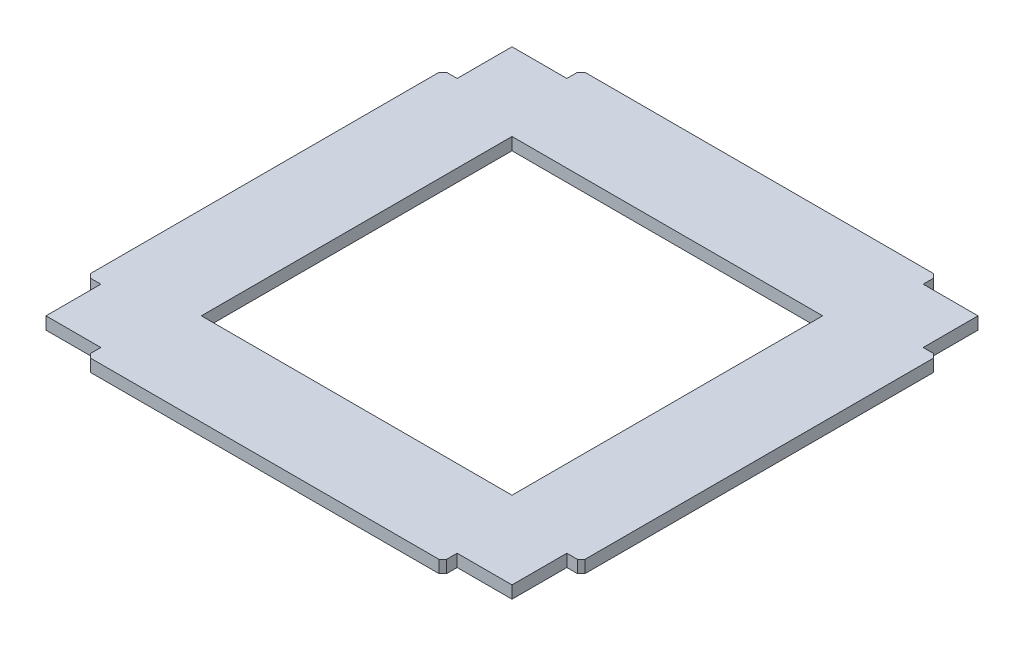
ISO-10303-21;
HEADER;
FILE_DESCRIPTION(('STEP AP214'),'2;1');
FILE_NAME('part.step','',(''),(''),'','','');
FILE_SCHEMA(('AUTOMOTIVE_DESIGN { 1 0 10303 214 1 1 1 1 }'));
ENDSEC;
DATA;
#1=APPLICATION_CONTEXT('core data for automotive mechanical design processes');
#2=APPLICATION_PROTOCOL_DEFINITION('international standard','automotive_design',2000,#1);
#3=PRODUCT_CONTEXT('',#1,'mechanical');
#4=PRODUCT('Part','Part','',(#3));
#5=PRODUCT_RELATED_PRODUCT_CATEGORY('part','',(#4));
#6=PRODUCT_DEFINITION_FORMATION('','',#4);
#7=PRODUCT_DEFINITION_CONTEXT('part definition',#1,'design');
#8=PRODUCT_DEFINITION('design','',#6,#7);
#9=PRODUCT_DEFINITION_SHAPE('','',#8);
#10=(LENGTH_UNIT() NAMED_UNIT(*) SI_UNIT(.MILLI.,.METRE.));
#11=(NAMED_UNIT(*) PLANE_ANGLE_UNIT() SI_UNIT($,.RADIAN.));
#12=(NAMED_UNIT(*) SI_UNIT($,.STERADIAN.) SOLID_ANGLE_UNIT());
#13=UNCERTAINTY_MEASURE_WITH_UNIT(LENGTH_MEASURE(1.E-05),#10,'distance_accuracy_value','');
#14=(GEOMETRIC_REPRESENTATION_CONTEXT(3) GLOBAL_UNCERTAINTY_ASSIGNED_CONTEXT((#13)) GLOBAL_UNIT_ASSIGNED_CONTEXT((#10,
#11,#12)) REPRESENTATION_CONTEXT('',''));
#15=CARTESIAN_POINT('',(0.,0.,0.));
#16=DIRECTION('',(0.,0.,1.));
#17=DIRECTION('',(1.,0.,0.));
#18=AXIS2_PLACEMENT_3D('',#15,#16,#17);
#19=CARTESIAN_POINT('',(963.13625,232.880925964842,80.899));
#20=DIRECTION('',(-1.,0.,0.));
#21=DIRECTION('',(0.,0.,1.));
#22=AXIS2_PLACEMENT_3D('',#19,#20,#21);
#23=PLANE('',#22);
#24=DIRECTION('',(0.,0.,-1.));
#25=VECTOR('',#24,1.);
#26=CARTESIAN_POINT('',(963.13625,4.06400000000001,80.899));
#27=LINE('',#26,#25);
#28=CARTESIAN_POINT('',(963.13625,4.06400000000001,79.6490000000001));
#29=VERTEX_POINT('',#28);
#30=CARTESIAN_POINT('',(963.13625,4.06400000000001,76.2000000000001));
#31=VERTEX_POINT('',#30);
#32=EDGE_CURVE('E512',#29,#31,#27,.T.);
#33=ORIENTED_EDGE('',*,*,#32,.F.);
#34=DIRECTION('',(0.,-1.,0.));
#35=VECTOR('',#34,1.);
#36=CARTESIAN_POINT('',(963.13625,232.880925964842,79.6490000000001));
#37=LINE('',#36,#35);
#38=CARTESIAN_POINT('',(963.13625,0.,79.6490000000001));
#39=VERTEX_POINT('',#38);
#40=EDGE_CURVE('E399',#29,#39,#37,.T.);
#41=ORIENTED_EDGE('',*,*,#40,.T.);
#42=DIRECTION('',(0.,0.,-1.));
#43=VECTOR('',#42,1.);
#44=CARTESIAN_POINT('',(963.13625,0.,80.899));
#45=LINE('',#44,#43);
#46=CARTESIAN_POINT('',(963.13625,0.,76.2000000000001));
#47=VERTEX_POINT('',#46);
#48=EDGE_CURVE('E330',#39,#47,#45,.T.);
#49=ORIENTED_EDGE('',*,*,#48,.T.);
#50=DIRECTION('',(0.,-1.,0.));
#51=VECTOR('',#50,1.);
#52=CARTESIAN_POINT('',(963.13625,232.880925964842,76.2000000000001));
#53=LINE('',#52,#51);
#54=EDGE_CURVE('E332',#31,#47,#53,.T.);
#55=ORIENTED_EDGE('',*,*,#54,.F.);
#56=EDGE_LOOP('',(#33,#41,#49,#55));
#57=FACE_BOUND('',#56,.T.);
#58=ADVANCED_FACE('F33',(#57),#23,.F.);
#59=CARTESIAN_POINT('',(846.613750000001,232.880925964842,80.899));
#60=DIRECTION('',(0.,0.,-1.));
#61=DIRECTION('',(-1.,0.,0.));
#62=AXIS2_PLACEMENT_3D('',#59,#60,#61);
#63=PLANE('',#62);
#64=DIRECTION('',(1.,0.,0.));
#65=VECTOR('',#64,1.);
#66=CARTESIAN_POINT('',(846.613750000001,0.,80.899));
#67=LINE('',#66,#65);
#68=CARTESIAN_POINT('',(847.863750000001,0.,80.899));
#69=VERTEX_POINT('',#68);
#70=CARTESIAN_POINT('',(961.88625,0.,80.899));
#71=VERTEX_POINT('',#70);
#72=EDGE_CURVE('E328',#69,#71,#67,.T.);
#73=ORIENTED_EDGE('',*,*,#72,.T.);
#74=DIRECTION('',(0.,1.,0.));
#75=VECTOR('',#74,1.);
#76=CARTESIAN_POINT('',(961.88625,232.880925964842,80.899));
#77=LINE('',#76,#75);
#78=CARTESIAN_POINT('',(961.88625,4.06400000000001,80.899));
#79=VERTEX_POINT('',#78);
#80=EDGE_CURVE('E48',#71,#79,#77,.T.);
#81=ORIENTED_EDGE('',*,*,#80,.T.);
#82=DIRECTION('',(1.,0.,0.));
#83=VECTOR('',#82,1.);
#84=CARTESIAN_POINT('',(846.613750000001,4.06400000000001,80.899));
#85=LINE('',#84,#83);
#86=CARTESIAN_POINT('',(847.863750000001,4.06400000000001,80.899));
#87=VERTEX_POINT('',#86);
#88=EDGE_CURVE('E516',#87,#79,#85,.T.);
#89=ORIENTED_EDGE('',*,*,#88,.F.);
#90=DIRECTION('',(0.,-1.,0.));
#91=VECTOR('',#90,1.);
#92=CARTESIAN_POINT('',(847.863750000001,232.880925964842,80.899));
#93=LINE('',#92,#91);
#94=EDGE_CURVE('E402',#87,#69,#93,.T.);
#95=ORIENTED_EDGE('',*,*,#94,.T.);
#96=EDGE_LOOP('',(#73,#81,#89,#95));
#97=FACE_BOUND('',#96,.T.);
#98=ADVANCED_FACE('F535',(#97),#63,.F.);
#99=CARTESIAN_POINT('',(846.613750000001,232.880925964842,80.899));
#100=DIRECTION('',(1.,0.,0.));
#101=DIRECTION('',(0.,0.,-1.));
#102=AXIS2_PLACEMENT_3D('',#99,#100,#101);
#103=PLANE('',#102);
#104=DIRECTION('',(0.,0.,1.));
#105=VECTOR('',#104,1.);
#106=CARTESIAN_POINT('',(846.613750000001,0.,80.899));
#107=LINE('',#106,#105);
#108=CARTESIAN_POINT('',(846.613750000001,0.,76.2000000000001));
#109=VERTEX_POINT('',#108);
#110=CARTESIAN_POINT('',(846.613750000001,0.,79.649));
#111=VERTEX_POINT('',#110);
#112=EDGE_CURVE('E325',#109,#111,#107,.T.);
#113=ORIENTED_EDGE('',*,*,#112,.T.);
#114=DIRECTION('',(0.,1.,0.));
#115=VECTOR('',#114,1.);
#116=CARTESIAN_POINT('',(846.613750000001,232.880925964842,79.649));
#117=LINE('',#116,#115);
#118=CARTESIAN_POINT('',(846.613750000001,4.06400000000001,79.649));
#119=VERTEX_POINT('',#118);
#120=EDGE_CURVE('E406',#111,#119,#117,.T.);
#121=ORIENTED_EDGE('',*,*,#120,.T.);
#122=DIRECTION('',(0.,0.,1.));
#123=VECTOR('',#122,1.);
#124=CARTESIAN_POINT('',(846.613750000001,4.06400000000001,80.899));
#125=LINE('',#124,#123);
#126=CARTESIAN_POINT('',(846.613750000001,4.06400000000007,76.2000000000001));
#127=VERTEX_POINT('',#126);
#128=EDGE_CURVE('E518',#127,#119,#125,.T.);
#129=ORIENTED_EDGE('',*,*,#128,.F.);
#130=DIRECTION('',(0.,-1.,0.));
#131=VECTOR('',#130,1.);
#132=CARTESIAN_POINT('',(846.613750000001,232.880925964842,76.2000000000001));
#133=LINE('',#132,#131);
#134=EDGE_CURVE('E335',#127,#109,#133,.T.);
#135=ORIENTED_EDGE('',*,*,#134,.T.);
#136=EDGE_LOOP('',(#113,#121,#129,#135));
#137=FACE_BOUND('',#136,.T.);
#138=ADVANCED_FACE('F531',(#137),#103,.F.);
#139=CARTESIAN_POINT('',(846.613750000001,232.880925964842,76.2000000000001));
#140=DIRECTION('',(0.,0.,-1.));
#141=DIRECTION('',(-1.,0.,0.));
#142=AXIS2_PLACEMENT_3D('',#139,#140,#141);
#143=PLANE('',#142);
#144=DIRECTION('',(1.,0.,0.));
#145=VECTOR('',#144,1.);
#146=CARTESIAN_POINT('',(846.613750000001,4.06400000000001,76.2000000000001));
#147=LINE('',#146,#145);
#148=CARTESIAN_POINT('',(828.675,4.06400000000007,76.2000000000001));
#149=VERTEX_POINT('',#148);
#150=EDGE_CURVE('E465',#149,#127,#147,.T.);
#151=ORIENTED_EDGE('',*,*,#150,.F.);
#152=DIRECTION('',(0.,-1.,0.));
#153=VECTOR('',#152,1.);
#154=CARTESIAN_POINT('',(828.675,232.880925964842,76.2000000000001));
#155=LINE('',#154,#153);
#156=CARTESIAN_POINT('',(828.675,0.,76.2000000000001));
#157=VERTEX_POINT('',#156);
#158=EDGE_CURVE('E337',#149,#157,#155,.T.);
#159=ORIENTED_EDGE('',*,*,#158,.T.);
#160=DIRECTION('',(1.,0.,0.));
#161=VECTOR('',#160,1.);
#162=CARTESIAN_POINT('',(846.613750000001,0.,76.2000000000001));
#163=LINE('',#162,#161);
#164=EDGE_CURVE('E322',#157,#109,#163,.T.);
#165=ORIENTED_EDGE('',*,*,#164,.T.);
#166=ORIENTED_EDGE('',*,*,#134,.F.);
#167=EDGE_LOOP('',(#151,#159,#165,#166));
#168=FACE_BOUND('',#167,.T.);
#169=ADVANCED_FACE('F523',(#168),#143,.F.);
#170=CARTESIAN_POINT('',(828.675,232.880925964842,76.2000000000001));
#171=DIRECTION('',(1.,0.,0.));
#172=DIRECTION('',(0.,0.,-1.));
#173=AXIS2_PLACEMENT_3D('',#170,#171,#172);
#174=PLANE('',#173);
#175=DIRECTION('',(0.,0.,1.));
#176=VECTOR('',#175,1.);
#177=CARTESIAN_POINT('',(828.675,4.06400000000001,76.2000000000001));
#178=LINE('',#177,#176);
#179=CARTESIAN_POINT('',(828.675,4.06400000000007,58.2612499999995));
#180=VERTEX_POINT('',#179);
#181=EDGE_CURVE('E462',#180,#149,#178,.T.);
#182=ORIENTED_EDGE('',*,*,#181,.F.);
#183=DIRECTION('',(0.,-1.,0.));
#184=VECTOR('',#183,1.);
#185=CARTESIAN_POINT('',(828.675,232.880925964842,58.2612499999995));
#186=LINE('',#185,#184);
#187=CARTESIAN_POINT('',(828.675,0.,58.2612499999995));
#188=VERTEX_POINT('',#187);
#189=EDGE_CURVE('E339',#180,#188,#186,.T.);
#190=ORIENTED_EDGE('',*,*,#189,.T.);
#191=DIRECTION('',(0.,0.,1.));
#192=VECTOR('',#191,1.);
#193=CARTESIAN_POINT('',(828.675,0.,76.2000000000001));
#194=LINE('',#193,#192);
#195=EDGE_CURVE('E319',#188,#157,#194,.T.);
#196=ORIENTED_EDGE('',*,*,#195,.T.);
#197=ORIENTED_EDGE('',*,*,#158,.F.);
#198=EDGE_LOOP('',(#182,#190,#196,#197));
#199=FACE_BOUND('',#198,.T.);
#200=ADVANCED_FACE('F525',(#199),#174,.F.);
#201=CARTESIAN_POINT('',(823.976,232.880925964842,58.2612499999995));
#202=DIRECTION('',(0.,0.,-1.));
#203=DIRECTION('',(-1.,0.,0.));
#204=AXIS2_PLACEMENT_3D('',#201,#202,#203);
#205=PLANE('',#204);
#206=DIRECTION('',(1.,0.,0.));
#207=VECTOR('',#206,1.);
#208=CARTESIAN_POINT('',(823.976,4.06400000000001,58.2612499999995));
#209=LINE('',#208,#207);
#210=CARTESIAN_POINT('',(825.226,4.06400000000001,58.2612499999995));
#211=VERTEX_POINT('',#210);
#212=EDGE_CURVE('E459',#211,#180,#209,.T.);
#213=ORIENTED_EDGE('',*,*,#212,.F.);
#214=DIRECTION('',(0.,-1.,0.));
#215=VECTOR('',#214,1.);
#216=CARTESIAN_POINT('',(825.226,232.880925964842,58.2612499999995));
#217=LINE('',#216,#215);
#218=CARTESIAN_POINT('',(825.226,0.,58.2612499999995));
#219=VERTEX_POINT('',#218);
#220=EDGE_CURVE('E408',#211,#219,#217,.T.);
#221=ORIENTED_EDGE('',*,*,#220,.T.);
#222=DIRECTION('',(1.,0.,0.));
#223=VECTOR('',#222,1.);
#224=CARTESIAN_POINT('',(823.976,0.,58.2612499999995));
#225=LINE('',#224,#223);
#226=EDGE_CURVE('E317',#219,#188,#225,.T.);
#227=ORIENTED_EDGE('',*,*,#226,.T.);
#228=ORIENTED_EDGE('',*,*,#189,.F.);
#229=EDGE_LOOP('',(#213,#221,#227,#228));
#230=FACE_BOUND('',#229,.T.);
#231=ADVANCED_FACE('F457',(#230),#205,.F.);
#232=CARTESIAN_POINT('',(823.976,232.880925964842,-58.2612499999998));
#233=DIRECTION('',(1.,0.,0.));
#234=DIRECTION('',(0.,0.,-1.));
#235=AXIS2_PLACEMENT_3D('',#232,#233,#234);
#236=PLANE('',#235);
#237=DIRECTION('',(0.,0.,1.));
#238=VECTOR('',#237,1.);
#239=CARTESIAN_POINT('',(823.976,0.,-58.2612499999998));
#240=LINE('',#239,#238);
#241=CARTESIAN_POINT('',(823.976,0.,-57.0112499999999));
#242=VERTEX_POINT('',#241);
#243=CARTESIAN_POINT('',(823.976,0.,57.0112499999995));
#244=VERTEX_POINT('',#243);
#245=EDGE_CURVE('E314',#242,#244,#240,.T.);
#246=ORIENTED_EDGE('',*,*,#245,.T.);
#247=DIRECTION('',(0.,1.,0.));
#248=VECTOR('',#247,1.);
#249=CARTESIAN_POINT('',(823.976,232.880925964842,57.0112499999995));
#250=LINE('',#249,#248);
#251=CARTESIAN_POINT('',(823.976,4.06400000000001,57.0112499999995));
#252=VERTEX_POINT('',#251);
#253=EDGE_CURVE('E414',#244,#252,#250,.T.);
#254=ORIENTED_EDGE('',*,*,#253,.T.);
#255=DIRECTION('',(0.,0.,1.));
#256=VECTOR('',#255,1.);
#257=CARTESIAN_POINT('',(823.976,4.06400000000001,-58.2612499999998));
#258=LINE('',#257,#256);
#259=CARTESIAN_POINT('',(823.976,4.06400000000001,-57.0112499999999));
#260=VERTEX_POINT('',#259);
#261=EDGE_CURVE('E437',#260,#252,#258,.T.);
#262=ORIENTED_EDGE('',*,*,#261,.F.);
#263=DIRECTION('',(0.,-1.,0.));
#264=VECTOR('',#263,1.);
#265=CARTESIAN_POINT('',(823.976,232.880925964842,-57.0112499999999));
#266=LINE('',#265,#264);
#267=EDGE_CURVE('E411',#260,#242,#266,.T.);
#268=ORIENTED_EDGE('',*,*,#267,.T.);
#269=EDGE_LOOP('',(#246,#254,#262,#268));
#270=FACE_BOUND('',#269,.T.);
#271=ADVANCED_FACE('F443',(#270),#236,.F.);
#272=CARTESIAN_POINT('',(823.976,232.880925964842,-58.2612499999998));
#273=DIRECTION('',(0.,0.,1.));
#274=DIRECTION('',(1.,0.,0.));
#275=AXIS2_PLACEMENT_3D('',#272,#273,#274);
#276=PLANE('',#275);
#277=DIRECTION('',(-1.,0.,0.));
#278=VECTOR('',#277,1.);
#279=CARTESIAN_POINT('',(823.976,0.,-58.2612499999998));
#280=LINE('',#279,#278);
#281=CARTESIAN_POINT('',(828.675,0.,-58.2612499999998));
#282=VERTEX_POINT('',#281);
#283=CARTESIAN_POINT('',(825.226,0.,-58.2612499999998));
#284=VERTEX_POINT('',#283);
#285=EDGE_CURVE('E311',#282,#284,#280,.T.);
#286=ORIENTED_EDGE('',*,*,#285,.T.);
#287=DIRECTION('',(0.,1.,0.));
#288=VECTOR('',#287,1.);
#289=CARTESIAN_POINT('',(825.226,232.880925964842,-58.2612499999998));
#290=LINE('',#289,#288);
#291=CARTESIAN_POINT('',(825.226,4.06400000000001,-58.2612499999998));
#292=VERTEX_POINT('',#291);
#293=EDGE_CURVE('E41',#284,#292,#290,.T.);
#294=ORIENTED_EDGE('',*,*,#293,.T.);
#295=DIRECTION('',(-1.,0.,0.));
#296=VECTOR('',#295,1.);
#297=CARTESIAN_POINT('',(823.976,4.06400000000001,-58.2612499999998));
#298=LINE('',#297,#296);
#299=CARTESIAN_POINT('',(828.675,4.06400000000007,-58.2612499999998));
#300=VERTEX_POINT('',#299);
#301=EDGE_CURVE('E426',#300,#292,#298,.T.);
#302=ORIENTED_EDGE('',*,*,#301,.F.);
#303=DIRECTION('',(0.,-1.,0.));
#304=VECTOR('',#303,1.);
#305=CARTESIAN_POINT('',(828.675,232.880925964842,-58.2612499999998));
#306=LINE('',#305,#304);
#307=EDGE_CURVE('E342',#300,#282,#306,.T.);
#308=ORIENTED_EDGE('',*,*,#307,.T.);
#309=EDGE_LOOP('',(#286,#294,#302,#308));
#310=FACE_BOUND('',#309,.T.);
#311=ADVANCED_FACE('F425',(#310),#276,.F.);
#312=CARTESIAN_POINT('',(828.675,232.880925964842,-58.2612499999998));
#313=DIRECTION('',(1.,0.,0.));
#314=DIRECTION('',(0.,0.,-1.));
#315=AXIS2_PLACEMENT_3D('',#312,#313,#314);
#316=PLANE('',#315);
#317=DIRECTION('',(0.,0.,1.));
#318=VECTOR('',#317,1.);
#319=CARTESIAN_POINT('',(828.675,4.06400000000001,-58.2612499999998));
#320=LINE('',#319,#318);
#321=CARTESIAN_POINT('',(828.675,4.06400000000007,-76.2));
#322=VERTEX_POINT('',#321);
#323=EDGE_CURVE('E436',#322,#300,#320,.T.);
#324=ORIENTED_EDGE('',*,*,#323,.F.);
#325=DIRECTION('',(0.,-1.,0.));
#326=VECTOR('',#325,1.);
#327=CARTESIAN_POINT('',(828.675,232.880925964842,-76.2));
#328=LINE('',#327,#326);
#329=CARTESIAN_POINT('',(828.675,0.,-76.2));
#330=VERTEX_POINT('',#329);
#331=EDGE_CURVE('E344',#322,#330,#328,.T.);
#332=ORIENTED_EDGE('',*,*,#331,.T.);
#333=DIRECTION('',(0.,0.,1.));
#334=VECTOR('',#333,1.);
#335=CARTESIAN_POINT('',(828.675,0.,-58.2612499999998));
#336=LINE('',#335,#334);
#337=EDGE_CURVE('E308',#330,#282,#336,.T.);
#338=ORIENTED_EDGE('',*,*,#337,.T.);
#339=ORIENTED_EDGE('',*,*,#307,.F.);
#340=EDGE_LOOP('',(#324,#332,#338,#339));
#341=FACE_BOUND('',#340,.T.);
#342=ADVANCED_FACE('F610',(#341),#316,.F.);
#343=CARTESIAN_POINT('',(828.675,232.880925964842,-76.2));
#344=DIRECTION('',(0.,0.,1.));
#345=DIRECTION('',(1.,0.,0.));
#346=AXIS2_PLACEMENT_3D('',#343,#344,#345);
#347=PLANE('',#346);
#348=DIRECTION('',(-1.,0.,0.));
#349=VECTOR('',#348,1.);
#350=CARTESIAN_POINT('',(828.675,4.06400000000001,-76.2));
#351=LINE('',#350,#349);
#352=CARTESIAN_POINT('',(846.61375,4.06400000000007,-76.2));
#353=VERTEX_POINT('',#352);
#354=EDGE_CURVE('E470',#353,#322,#351,.T.);
#355=ORIENTED_EDGE('',*,*,#354,.F.);
#356=DIRECTION('',(0.,-1.,0.));
#357=VECTOR('',#356,1.);
#358=CARTESIAN_POINT('',(846.61375,232.880925964842,-76.2));
#359=LINE('',#358,#357);
#360=CARTESIAN_POINT('',(846.61375,0.,-76.2));
#361=VERTEX_POINT('',#360);
#362=EDGE_CURVE('E346',#353,#361,#359,.T.);
#363=ORIENTED_EDGE('',*,*,#362,.T.);
#364=DIRECTION('',(-1.,0.,0.));
#365=VECTOR('',#364,1.);
#366=CARTESIAN_POINT('',(828.675,0.,-76.2));
#367=LINE('',#366,#365);
#368=EDGE_CURVE('E305',#361,#330,#367,.T.);
#369=ORIENTED_EDGE('',*,*,#368,.T.);
#370=ORIENTED_EDGE('',*,*,#331,.F.);
#371=EDGE_LOOP('',(#355,#363,#369,#370));
#372=FACE_BOUND('',#371,.T.);
#373=ADVANCED_FACE('F607',(#372),#347,.F.);
#374=CARTESIAN_POINT('',(846.61375,232.880925964842,-80.8990000000002));
#375=DIRECTION('',(1.,0.,0.));
#376=DIRECTION('',(0.,0.,-1.));
#377=AXIS2_PLACEMENT_3D('',#374,#375,#376);
#378=PLANE('',#377);
#379=DIRECTION('',(0.,0.,1.));
#380=VECTOR('',#379,1.);
#381=CARTESIAN_POINT('',(846.61375,4.06400000000001,-80.8990000000002));
#382=LINE('',#381,#380);
#383=CARTESIAN_POINT('',(846.61375,4.06400000000001,-79.6490000000003));
#384=VERTEX_POINT('',#383);
#385=EDGE_CURVE('E472',#384,#353,#382,.T.);
#386=ORIENTED_EDGE('',*,*,#385,.F.);
#387=DIRECTION('',(0.,-1.,0.));
#388=VECTOR('',#387,1.);
#389=CARTESIAN_POINT('',(846.61375,232.880925964842,-79.6490000000003));
#390=LINE('',#389,#388);
#391=CARTESIAN_POINT('',(846.61375,0.,-79.6490000000003));
#392=VERTEX_POINT('',#391);
#393=EDGE_CURVE('E11',#384,#392,#390,.T.);
#394=ORIENTED_EDGE('',*,*,#393,.T.);
#395=DIRECTION('',(0.,0.,1.));
#396=VECTOR('',#395,1.);
#397=CARTESIAN_POINT('',(846.61375,0.,-80.8990000000002));
#398=LINE('',#397,#396);
#399=EDGE_CURVE('E303',#392,#361,#398,.T.);
#400=ORIENTED_EDGE('',*,*,#399,.T.);
#401=ORIENTED_EDGE('',*,*,#362,.F.);
#402=EDGE_LOOP('',(#386,#394,#400,#401));
#403=FACE_BOUND('',#402,.T.);
#404=ADVANCED_FACE('F602',(#403),#378,.F.);
#405=CARTESIAN_POINT('',(846.61375,232.880925964842,-80.8990000000002));
#406=DIRECTION('',(0.,0.,1.));
#407=DIRECTION('',(1.,0.,0.));
#408=AXIS2_PLACEMENT_3D('',#405,#406,#407);
#409=PLANE('',#408);
#410=DIRECTION('',(-1.,0.,0.));
#411=VECTOR('',#410,1.);
#412=CARTESIAN_POINT('',(846.61375,4.06400000000001,-80.8990000000002));
#413=LINE('',#412,#411);
#414=CARTESIAN_POINT('',(961.88625,4.06400000000001,-80.899));
#415=VERTEX_POINT('',#414);
#416=CARTESIAN_POINT('',(847.86375,4.06400000000001,-80.8990000000002));
#417=VERTEX_POINT('',#416);
#418=EDGE_CURVE('E474',#415,#417,#413,.T.);
#419=ORIENTED_EDGE('',*,*,#418,.F.);
#420=DIRECTION('',(0.,-1.,0.));
#421=VECTOR('',#420,1.);
#422=CARTESIAN_POINT('',(961.88625,232.880925964842,-80.899));
#423=LINE('',#422,#421);
#424=CARTESIAN_POINT('',(961.88625,0.,-80.899));
#425=VERTEX_POINT('',#424);
#426=EDGE_CURVE('E418',#415,#425,#423,.T.);
#427=ORIENTED_EDGE('',*,*,#426,.T.);
#428=DIRECTION('',(-1.,0.,0.));
#429=VECTOR('',#428,1.);
#430=CARTESIAN_POINT('',(846.61375,0.,-80.8990000000002));
#431=LINE('',#430,#429);
#432=CARTESIAN_POINT('',(847.86375,0.,-80.8990000000002));
#433=VERTEX_POINT('',#432);
#434=EDGE_CURVE('E300',#425,#433,#431,.T.);
#435=ORIENTED_EDGE('',*,*,#434,.T.);
#436=DIRECTION('',(0.,1.,0.));
#437=VECTOR('',#436,1.);
#438=CARTESIAN_POINT('',(847.86375,232.880925964842,-80.8990000000002));
#439=LINE('',#438,#437);
#440=EDGE_CURVE('E416',#433,#417,#439,.T.);
#441=ORIENTED_EDGE('',*,*,#440,.T.);
#442=EDGE_LOOP('',(#419,#427,#435,#441));
#443=FACE_BOUND('',#442,.T.);
#444=ADVANCED_FACE('F593',(#443),#409,.F.);
#445=CARTESIAN_POINT('',(963.13625,232.880925964842,-80.899));
#446=DIRECTION('',(-1.,0.,0.));
#447=DIRECTION('',(0.,0.,1.));
#448=AXIS2_PLACEMENT_3D('',#445,#446,#447);
#449=PLANE('',#448);
#450=DIRECTION('',(0.,0.,-1.));
#451=VECTOR('',#450,1.);
#452=CARTESIAN_POINT('',(963.13625,0.,-80.899));
#453=LINE('',#452,#451);
#454=CARTESIAN_POINT('',(963.13625,0.,-76.1999999999999));
#455=VERTEX_POINT('',#454);
#456=CARTESIAN_POINT('',(963.13625,0.,-79.6490000000001));
#457=VERTEX_POINT('',#456);
#458=EDGE_CURVE('E297',#455,#457,#453,.T.);
#459=ORIENTED_EDGE('',*,*,#458,.T.);
#460=DIRECTION('',(0.,1.,0.));
#461=VECTOR('',#460,1.);
#462=CARTESIAN_POINT('',(963.13625,232.880925964842,-79.6490000000001));
#463=LINE('',#462,#461);
#464=CARTESIAN_POINT('',(963.13625,4.06400000000001,-79.6490000000001));
#465=VERTEX_POINT('',#464);
#466=EDGE_CURVE('E421',#457,#465,#463,.T.);
#467=ORIENTED_EDGE('',*,*,#466,.T.);
#468=DIRECTION('',(0.,0.,-1.));
#469=VECTOR('',#468,1.);
#470=CARTESIAN_POINT('',(963.13625,4.06400000000001,-80.899));
#471=LINE('',#470,#469);
#472=CARTESIAN_POINT('',(963.13625,4.06400000000007,-76.1999999999999));
#473=VERTEX_POINT('',#472);
#474=EDGE_CURVE('E477',#473,#465,#471,.T.);
#475=ORIENTED_EDGE('',*,*,#474,.F.);
#476=DIRECTION('',(0.,-1.,0.));
#477=VECTOR('',#476,1.);
#478=CARTESIAN_POINT('',(963.13625,232.880925964842,-76.1999999999999));
#479=LINE('',#478,#477);
#480=EDGE_CURVE('E349',#473,#455,#479,.T.);
#481=ORIENTED_EDGE('',*,*,#480,.T.);
#482=EDGE_LOOP('',(#459,#467,#475,#481));
#483=FACE_BOUND('',#482,.T.);
#484=ADVANCED_FACE('F675',(#483),#449,.F.);
#485=CARTESIAN_POINT('',(963.13625,232.880925964842,-76.1999999999999));
#486=DIRECTION('',(0.,0.,1.));
#487=DIRECTION('',(1.,0.,0.));
#488=AXIS2_PLACEMENT_3D('',#485,#486,#487);
#489=PLANE('',#488);
#490=DIRECTION('',(-1.,0.,0.));
#491=VECTOR('',#490,1.);
#492=CARTESIAN_POINT('',(963.13625,4.06400000000001,-76.1999999999999));
#493=LINE('',#492,#491);
#494=CARTESIAN_POINT('',(981.075,4.06400000000007,-76.2));
#495=VERTEX_POINT('',#494);
#496=EDGE_CURVE('E480',#495,#473,#493,.T.);
#497=ORIENTED_EDGE('',*,*,#496,.F.);
#498=DIRECTION('',(0.,-1.,0.));
#499=VECTOR('',#498,1.);
#500=CARTESIAN_POINT('',(981.075,232.880925964842,-76.2));
#501=LINE('',#500,#499);
#502=CARTESIAN_POINT('',(981.075,0.,-76.2));
#503=VERTEX_POINT('',#502);
#504=EDGE_CURVE('E351',#495,#503,#501,.T.);
#505=ORIENTED_EDGE('',*,*,#504,.T.);
#506=DIRECTION('',(-1.,0.,0.));
#507=VECTOR('',#506,1.);
#508=CARTESIAN_POINT('',(963.13625,0.,-76.1999999999999));
#509=LINE('',#508,#507);
#510=EDGE_CURVE('E294',#503,#455,#509,.T.);
#511=ORIENTED_EDGE('',*,*,#510,.T.);
#512=ORIENTED_EDGE('',*,*,#480,.F.);
#513=EDGE_LOOP('',(#497,#505,#511,#512));
#514=FACE_BOUND('',#513,.T.);
#515=ADVANCED_FACE('F583',(#514),#489,.F.);
#516=CARTESIAN_POINT('',(981.075,232.880925964842,-76.2));
#517=DIRECTION('',(-1.,0.,0.));
#518=DIRECTION('',(0.,0.,1.));
#519=AXIS2_PLACEMENT_3D('',#516,#517,#518);
#520=PLANE('',#519);
#521=DIRECTION('',(0.,0.,-1.));
#522=VECTOR('',#521,1.);
#523=CARTESIAN_POINT('',(981.075,4.06400000000001,-76.2));
#524=LINE('',#523,#522);
#525=CARTESIAN_POINT('',(981.075,4.06400000000007,-58.2612499999995));
#526=VERTEX_POINT('',#525);
#527=EDGE_CURVE('E483',#526,#495,#524,.T.);
#528=ORIENTED_EDGE('',*,*,#527,.F.);
#529=DIRECTION('',(0.,-1.,0.));
#530=VECTOR('',#529,1.);
#531=CARTESIAN_POINT('',(981.075,232.880925964842,-58.2612499999995));
#532=LINE('',#531,#530);
#533=CARTESIAN_POINT('',(981.075,0.,-58.2612499999995));
#534=VERTEX_POINT('',#533);
#535=EDGE_CURVE('E353',#526,#534,#532,.T.);
#536=ORIENTED_EDGE('',*,*,#535,.T.);
#537=DIRECTION('',(0.,0.,-1.));
#538=VECTOR('',#537,1.);
#539=CARTESIAN_POINT('',(981.075,0.,-76.2));
#540=LINE('',#539,#538);
#541=EDGE_CURVE('E291',#534,#503,#540,.T.);
#542=ORIENTED_EDGE('',*,*,#541,.T.);
#543=ORIENTED_EDGE('',*,*,#504,.F.);
#544=EDGE_LOOP('',(#528,#536,#542,#543));
#545=FACE_BOUND('',#544,.T.);
#546=ADVANCED_FACE('F577',(#545),#520,.F.);
#547=CARTESIAN_POINT('',(985.774,232.880925964842,-58.2612499999995));
#548=DIRECTION('',(0.,0.,1.));
#549=DIRECTION('',(1.,0.,0.));
#550=AXIS2_PLACEMENT_3D('',#547,#548,#549);
#551=PLANE('',#550);
#552=DIRECTION('',(-1.,0.,0.));
#553=VECTOR('',#552,1.);
#554=CARTESIAN_POINT('',(985.774,4.06400000000001,-58.2612499999995));
#555=LINE('',#554,#553);
#556=CARTESIAN_POINT('',(984.524,4.06400000000001,-58.2612499999995));
#557=VERTEX_POINT('',#556);
#558=EDGE_CURVE('E486',#557,#526,#555,.T.);
#559=ORIENTED_EDGE('',*,*,#558,.F.);
#560=DIRECTION('',(0.,-1.,0.));
#561=VECTOR('',#560,1.);
#562=CARTESIAN_POINT('',(984.524,232.880925964842,-58.2612499999995));
#563=LINE('',#562,#561);
#564=CARTESIAN_POINT('',(984.524,0.,-58.2612499999995));
#565=VERTEX_POINT('',#564);
#566=EDGE_CURVE('E253',#557,#565,#563,.T.);
#567=ORIENTED_EDGE('',*,*,#566,.T.);
#568=DIRECTION('',(-1.,0.,0.));
#569=VECTOR('',#568,1.);
#570=CARTESIAN_POINT('',(985.774,0.,-58.2612499999995));
#571=LINE('',#570,#569);
#572=EDGE_CURVE('E289',#565,#534,#571,.T.);
#573=ORIENTED_EDGE('',*,*,#572,.T.);
#574=ORIENTED_EDGE('',*,*,#535,.F.);
#575=EDGE_LOOP('',(#559,#567,#573,#574));
#576=FACE_BOUND('',#575,.T.);
#577=ADVANCED_FACE('F574',(#576),#551,.F.);
#578=CARTESIAN_POINT('',(985.774,232.880925964842,58.2612499999999));
#579=DIRECTION('',(-1.,0.,0.));
#580=DIRECTION('',(0.,0.,1.));
#581=AXIS2_PLACEMENT_3D('',#578,#579,#580);
#582=PLANE('',#581);
#583=DIRECTION('',(0.,0.,-1.));
#584=VECTOR('',#583,1.);
#585=CARTESIAN_POINT('',(985.774,0.,58.2612499999999));
#586=LINE('',#585,#584);
#587=CARTESIAN_POINT('',(985.774,0.,57.01125));
#588=VERTEX_POINT('',#587);
#589=CARTESIAN_POINT('',(985.774,0.,-57.0112499999994));
#590=VERTEX_POINT('',#589);
#591=EDGE_CURVE('E286',#588,#590,#586,.T.);
#592=ORIENTED_EDGE('',*,*,#591,.T.);
#593=DIRECTION('',(0.,1.,0.));
#594=VECTOR('',#593,1.);
#595=CARTESIAN_POINT('',(985.774,232.880925964842,-57.0112499999994));
#596=LINE('',#595,#594);
#597=CARTESIAN_POINT('',(985.774,4.06400000000001,-57.0112499999994));
#598=VERTEX_POINT('',#597);
#599=EDGE_CURVE('E380',#590,#598,#596,.T.);
#600=ORIENTED_EDGE('',*,*,#599,.T.);
#601=DIRECTION('',(0.,0.,-1.));
#602=VECTOR('',#601,1.);
#603=CARTESIAN_POINT('',(985.774,4.06400000000001,58.2612499999999));
#604=LINE('',#603,#602);
#605=CARTESIAN_POINT('',(985.774,4.06400000000001,57.01125));
#606=VERTEX_POINT('',#605);
#607=EDGE_CURVE('E488',#606,#598,#604,.T.);
#608=ORIENTED_EDGE('',*,*,#607,.F.);
#609=DIRECTION('',(0.,-1.,0.));
#610=VECTOR('',#609,1.);
#611=CARTESIAN_POINT('',(985.774,232.880925964842,57.01125));
#612=LINE('',#611,#610);
#613=EDGE_CURVE('E377',#606,#588,#612,.T.);
#614=ORIENTED_EDGE('',*,*,#613,.T.);
#615=EDGE_LOOP('',(#592,#600,#608,#614));
#616=FACE_BOUND('',#615,.T.);
#617=ADVANCED_FACE('F565',(#616),#582,.F.);
#618=CARTESIAN_POINT('',(985.774,232.880925964842,58.2612499999999));
#619=DIRECTION('',(0.,0.,-1.));
#620=DIRECTION('',(-1.,0.,0.));
#621=AXIS2_PLACEMENT_3D('',#618,#619,#620);
#622=PLANE('',#621);
#623=DIRECTION('',(1.,0.,0.));
#624=VECTOR('',#623,1.);
#625=CARTESIAN_POINT('',(985.774,0.,58.2612499999999));
#626=LINE('',#625,#624);
#627=CARTESIAN_POINT('',(981.075,0.,58.2612499999999));
#628=VERTEX_POINT('',#627);
#629=CARTESIAN_POINT('',(984.524,0.,58.2612499999999));
#630=VERTEX_POINT('',#629);
#631=EDGE_CURVE('E283',#628,#630,#626,.T.);
#632=ORIENTED_EDGE('',*,*,#631,.T.);
#633=DIRECTION('',(0.,1.,0.));
#634=VECTOR('',#633,1.);
#635=CARTESIAN_POINT('',(984.524,232.880925964842,58.2612499999999));
#636=LINE('',#635,#634);
#637=CARTESIAN_POINT('',(984.524,4.06400000000001,58.2612499999999));
#638=VERTEX_POINT('',#637);
#639=EDGE_CURVE('E397',#630,#638,#636,.T.);
#640=ORIENTED_EDGE('',*,*,#639,.T.);
#641=DIRECTION('',(1.,0.,0.));
#642=VECTOR('',#641,1.);
#643=CARTESIAN_POINT('',(985.774,4.06400000000001,58.2612499999999));
#644=LINE('',#643,#642);
#645=CARTESIAN_POINT('',(981.075,4.06400000000007,58.2612499999999));
#646=VERTEX_POINT('',#645);
#647=EDGE_CURVE('E490',#646,#638,#644,.T.);
#648=ORIENTED_EDGE('',*,*,#647,.F.);
#649=DIRECTION('',(0.,-1.,0.));
#650=VECTOR('',#649,1.);
#651=CARTESIAN_POINT('',(981.075,232.880925964842,58.2612499999999));
#652=LINE('',#651,#650);
#653=EDGE_CURVE('E356',#646,#628,#652,.T.);
#654=ORIENTED_EDGE('',*,*,#653,.T.);
#655=EDGE_LOOP('',(#632,#640,#648,#654));
#656=FACE_BOUND('',#655,.T.);
#657=ADVANCED_FACE('F557',(#656),#622,.F.);
#658=CARTESIAN_POINT('',(981.075,232.880925964842,58.2612499999999));
#659=DIRECTION('',(-1.,0.,0.));
#660=DIRECTION('',(0.,0.,1.));
#661=AXIS2_PLACEMENT_3D('',#658,#659,#660);
#662=PLANE('',#661);
#663=DIRECTION('',(0.,0.,-1.));
#664=VECTOR('',#663,1.);
#665=CARTESIAN_POINT('',(981.075,4.06400000000001,58.2612499999999));
#666=LINE('',#665,#664);
#667=CARTESIAN_POINT('',(981.075,4.06400000000007,76.2000000000001));
#668=VERTEX_POINT('',#667);
#669=EDGE_CURVE('E493',#668,#646,#666,.T.);
#670=ORIENTED_EDGE('',*,*,#669,.F.);
#671=DIRECTION('',(0.,-1.,0.));
#672=VECTOR('',#671,1.);
#673=CARTESIAN_POINT('',(981.075,232.880925964842,76.2000000000001));
#674=LINE('',#673,#672);
#675=CARTESIAN_POINT('',(981.075,0.,76.2000000000001));
#676=VERTEX_POINT('',#675);
#677=EDGE_CURVE('E254',#668,#676,#674,.T.);
#678=ORIENTED_EDGE('',*,*,#677,.T.);
#679=DIRECTION('',(0.,0.,-1.));
#680=VECTOR('',#679,1.);
#681=CARTESIAN_POINT('',(981.075,0.,58.2612499999999));
#682=LINE('',#681,#680);
#683=EDGE_CURVE('E280',#676,#628,#682,.T.);
#684=ORIENTED_EDGE('',*,*,#683,.T.);
#685=ORIENTED_EDGE('',*,*,#653,.F.);
#686=EDGE_LOOP('',(#670,#678,#684,#685));
#687=FACE_BOUND('',#686,.T.);
#688=ADVANCED_FACE('F551',(#687),#662,.F.);
#689=CARTESIAN_POINT('',(981.075,232.880925964842,76.2000000000001));
#690=DIRECTION('',(0.,0.,-1.));
#691=DIRECTION('',(-1.,0.,0.));
#692=AXIS2_PLACEMENT_3D('',#689,#690,#691);
#693=PLANE('',#692);
#694=DIRECTION('',(1.,0.,0.));
#695=VECTOR('',#694,1.);
#696=CARTESIAN_POINT('',(981.075,4.06400000000001,76.2000000000001));
#697=LINE('',#696,#695);
#698=EDGE_CURVE('E496',#31,#668,#697,.T.);
#699=ORIENTED_EDGE('',*,*,#698,.F.);
#700=ORIENTED_EDGE('',*,*,#54,.T.);
#701=DIRECTION('',(1.,0.,0.));
#702=VECTOR('',#701,1.);
#703=CARTESIAN_POINT('',(981.075,0.,76.2000000000001));
#704=LINE('',#703,#702);
#705=EDGE_CURVE('E277',#47,#676,#704,.T.);
#706=ORIENTED_EDGE('',*,*,#705,.T.);
#707=ORIENTED_EDGE('',*,*,#677,.F.);
#708=EDGE_LOOP('',(#699,#700,#706,#707));
#709=FACE_BOUND('',#708,.T.);
#710=ADVANCED_FACE('F548',(#709),#693,.F.);
#711=CARTESIAN_POINT('',(0.,0.,0.));
#712=DIRECTION('',(0.,-1.,0.));
#713=DIRECTION('',(0.,0.,-1.));
#714=AXIS2_PLACEMENT_3D('',#711,#712,#713);
#715=PLANE('',#714);
#716=ORIENTED_EDGE('',*,*,#572,.F.);
#717=DIRECTION('',(-0.707106781186563,0.,-0.707106781186532));
#718=VECTOR('',#717,1.);
#719=CARTESIAN_POINT('',(521.392624999978,0.,-521.392625000001));
#720=LINE('',#719,#718);
#721=EDGE_CURVE('E375',#565,#590,#720,.F.);
#722=ORIENTED_EDGE('',*,*,#721,.T.);
#723=ORIENTED_EDGE('',*,*,#591,.F.);
#724=DIRECTION('',(0.707106781186532,0.,-0.707106781186563));
#725=VECTOR('',#724,1.);
#726=CARTESIAN_POINT('',(521.392625000022,0.,521.392624999999));
#727=LINE('',#726,#725);
#728=EDGE_CURVE('E373',#588,#630,#727,.F.);
#729=ORIENTED_EDGE('',*,*,#728,.T.);
#730=ORIENTED_EDGE('',*,*,#631,.F.);
#731=ORIENTED_EDGE('',*,*,#683,.F.);
#732=ORIENTED_EDGE('',*,*,#705,.F.);
#733=ORIENTED_EDGE('',*,*,#48,.F.);
#734=DIRECTION('',(0.707106781186563,0.,-0.707106781186532));
#735=VECTOR('',#734,1.);
#736=CARTESIAN_POINT('',(521.392624999978,0.,521.392625000002));
#737=LINE('',#736,#735);
#738=EDGE_CURVE('E371',#39,#71,#737,.F.);
#739=ORIENTED_EDGE('',*,*,#738,.T.);
#740=ORIENTED_EDGE('',*,*,#72,.F.);
#741=DIRECTION('',(0.707106781186563,0.,0.707106781186532));
#742=VECTOR('',#741,1.);
#743=CARTESIAN_POINT('',(383.482374999982,0.,-383.482374999999));
#744=LINE('',#743,#742);
#745=EDGE_CURVE('E369',#69,#111,#744,.F.);
#746=ORIENTED_EDGE('',*,*,#745,.T.);
#747=ORIENTED_EDGE('',*,*,#112,.F.);
#748=ORIENTED_EDGE('',*,*,#164,.F.);
#749=ORIENTED_EDGE('',*,*,#195,.F.);
#750=ORIENTED_EDGE('',*,*,#226,.F.);
#751=DIRECTION('',(0.707106781186555,0.,0.70710678118654));
#752=VECTOR('',#751,1.);
#753=CARTESIAN_POINT('',(383.482374999991,0.,-383.482375));
#754=LINE('',#753,#752);
#755=EDGE_CURVE('E367',#219,#244,#754,.F.);
#756=ORIENTED_EDGE('',*,*,#755,.T.);
#757=ORIENTED_EDGE('',*,*,#245,.F.);
#758=DIRECTION('',(-0.707106781186563,0.,0.707106781186532));
#759=VECTOR('',#758,1.);
#760=CARTESIAN_POINT('',(383.482374999982,0.,383.482374999999));
#761=LINE('',#760,#759);
#762=EDGE_CURVE('E363',#242,#284,#761,.F.);
#763=ORIENTED_EDGE('',*,*,#762,.T.);
#764=ORIENTED_EDGE('',*,*,#285,.F.);
#765=ORIENTED_EDGE('',*,*,#337,.F.);
#766=ORIENTED_EDGE('',*,*,#368,.F.);
#767=ORIENTED_EDGE('',*,*,#399,.F.);
#768=DIRECTION('',(-0.707106781186563,0.,0.707106781186532));
#769=VECTOR('',#768,1.);
#770=CARTESIAN_POINT('',(383.482374999981,0.,383.482374999998));
#771=LINE('',#770,#769);
#772=EDGE_CURVE('E361',#392,#433,#771,.F.);
#773=ORIENTED_EDGE('',*,*,#772,.T.);
#774=ORIENTED_EDGE('',*,*,#434,.F.);
#775=DIRECTION('',(-0.707106781186563,0.,-0.707106781186532));
#776=VECTOR('',#775,1.);
#777=CARTESIAN_POINT('',(521.392624999978,0.,-521.392625000002));
#778=LINE('',#777,#776);
#779=EDGE_CURVE('E365',#425,#457,#778,.F.);
#780=ORIENTED_EDGE('',*,*,#779,.T.);
#781=ORIENTED_EDGE('',*,*,#458,.F.);
#782=ORIENTED_EDGE('',*,*,#510,.F.);
#783=ORIENTED_EDGE('',*,*,#541,.F.);
#784=EDGE_LOOP('',(#716,#722,#723,#729,#730,#731,#732,#733,#739,#740,#746,#747,#748,#749,#750,
#756,#757,#763,#764,#765,#766,#767,#773,#774,#780,#781,#782,#783));
#785=FACE_BOUND('',#784,.T.);
#786=DIRECTION('',(-1.,0.,0.));
#787=VECTOR('',#786,1.);
#788=CARTESIAN_POINT('',(955.675,0.,-50.7999999999999));
#789=LINE('',#788,#787);
#790=CARTESIAN_POINT('',(955.675,0.,-50.7999999999999));
#791=VERTEX_POINT('',#790);
#792=CARTESIAN_POINT('',(854.075,0.,-50.7999999999999));
#793=VERTEX_POINT('',#792);
#794=EDGE_CURVE('E267',#791,#793,#789,.T.);
#795=ORIENTED_EDGE('',*,*,#794,.T.);
#796=DIRECTION('',(0.,0.,1.));
#797=VECTOR('',#796,1.);
#798=CARTESIAN_POINT('',(854.075,0.,-50.7999999999999));
#799=LINE('',#798,#797);
#800=CARTESIAN_POINT('',(854.075,0.,50.8));
#801=VERTEX_POINT('',#800);
#802=EDGE_CURVE('E499',#793,#801,#799,.T.);
#803=ORIENTED_EDGE('',*,*,#802,.T.);
#804=DIRECTION('',(1.,0.,0.));
#805=VECTOR('',#804,1.);
#806=CARTESIAN_POINT('',(955.675,0.,50.8));
#807=LINE('',#806,#805);
#808=CARTESIAN_POINT('',(955.675,0.,50.8));
#809=VERTEX_POINT('',#808);
#810=EDGE_CURVE('E502',#801,#809,#807,.T.);
#811=ORIENTED_EDGE('',*,*,#810,.T.);
#812=DIRECTION('',(0.,0.,-1.));
#813=VECTOR('',#812,1.);
#814=CARTESIAN_POINT('',(955.675,0.,-50.7999999999999));
#815=LINE('',#814,#813);
#816=EDGE_CURVE('E505',#809,#791,#815,.T.);
#817=ORIENTED_EDGE('',*,*,#816,.T.);
#818=EDGE_LOOP('',(#795,#803,#811,#817));
#819=FACE_BOUND('',#818,.T.);
#820=ADVANCED_FACE('F447',(#785,#819),#715,.T.);
#821=CARTESIAN_POINT('',(955.675,232.880925964842,-50.7999999999999));
#822=DIRECTION('',(0.,0.,1.));
#823=DIRECTION('',(1.,0.,0.));
#824=AXIS2_PLACEMENT_3D('',#821,#822,#823);
#825=PLANE('',#824);
#826=DIRECTION('',(0.,-1.,0.));
#827=VECTOR('',#826,1.);
#828=CARTESIAN_POINT('',(955.675,232.880925964842,-50.7999999999999));
#829=LINE('',#828,#827);
#830=CARTESIAN_POINT('',(955.675,4.06400000000001,-50.7999999999999));
#831=VERTEX_POINT('',#830);
#832=EDGE_CURVE('E259',#831,#791,#829,.T.);
#833=ORIENTED_EDGE('',*,*,#832,.F.);
#834=DIRECTION('',(-1.,0.,0.));
#835=VECTOR('',#834,1.);
#836=CARTESIAN_POINT('',(955.675,4.06400000000001,-50.7999999999999));
#837=LINE('',#836,#835);
#838=CARTESIAN_POINT('',(854.075,4.06400000000007,-50.7999999999999));
#839=VERTEX_POINT('',#838);
#840=EDGE_CURVE('E243',#831,#839,#837,.T.);
#841=ORIENTED_EDGE('',*,*,#840,.T.);
#842=DIRECTION('',(0.,-1.,0.));
#843=VECTOR('',#842,1.);
#844=CARTESIAN_POINT('',(854.075,232.880925964842,-50.7999999999999));
#845=LINE('',#844,#843);
#846=EDGE_CURVE('E269',#839,#793,#845,.T.);
#847=ORIENTED_EDGE('',*,*,#846,.T.);
#848=ORIENTED_EDGE('',*,*,#794,.F.);
#849=EDGE_LOOP('',(#833,#841,#847,#848));
#850=FACE_BOUND('',#849,.T.);
#851=ADVANCED_FACE('F265',(#850),#825,.T.);
#852=CARTESIAN_POINT('',(955.675,232.880925964842,-50.7999999999999));
#853=DIRECTION('',(-1.,0.,0.));
#854=DIRECTION('',(0.,0.,1.));
#855=AXIS2_PLACEMENT_3D('',#852,#853,#854);
#856=PLANE('',#855);
#857=DIRECTION('',(0.,-1.,0.));
#858=VECTOR('',#857,1.);
#859=CARTESIAN_POINT('',(955.675,232.880925964842,50.8));
#860=LINE('',#859,#858);
#861=CARTESIAN_POINT('',(955.675,4.06400000000001,50.8));
#862=VERTEX_POINT('',#861);
#863=EDGE_CURVE('E261',#862,#809,#860,.T.);
#864=ORIENTED_EDGE('',*,*,#863,.F.);
#865=DIRECTION('',(0.,0.,-1.));
#866=VECTOR('',#865,1.);
#867=CARTESIAN_POINT('',(955.675,4.06400000000001,-50.7999999999999));
#868=LINE('',#867,#866);
#869=EDGE_CURVE('E246',#862,#831,#868,.T.);
#870=ORIENTED_EDGE('',*,*,#869,.T.);
#871=ORIENTED_EDGE('',*,*,#832,.T.);
#872=ORIENTED_EDGE('',*,*,#816,.F.);
#873=EDGE_LOOP('',(#864,#870,#871,#872));
#874=FACE_BOUND('',#873,.T.);
#875=ADVANCED_FACE('F257',(#874),#856,.T.);
#876=CARTESIAN_POINT('',(955.675,232.880925964842,50.8));
#877=DIRECTION('',(0.,0.,-1.));
#878=DIRECTION('',(-1.,0.,0.));
#879=AXIS2_PLACEMENT_3D('',#876,#877,#878);
#880=PLANE('',#879);
#881=DIRECTION('',(0.,-1.,0.));
#882=VECTOR('',#881,1.);
#883=CARTESIAN_POINT('',(854.075,232.880925964842,50.8));
#884=LINE('',#883,#882);
#885=CARTESIAN_POINT('',(854.075,4.06400000000001,50.8));
#886=VERTEX_POINT('',#885);
#887=EDGE_CURVE('E271',#886,#801,#884,.T.);
#888=ORIENTED_EDGE('',*,*,#887,.F.);
#889=DIRECTION('',(1.,0.,0.));
#890=VECTOR('',#889,1.);
#891=CARTESIAN_POINT('',(955.675,4.06400000000001,50.8));
#892=LINE('',#891,#890);
#893=EDGE_CURVE('E263',#886,#862,#892,.T.);
#894=ORIENTED_EDGE('',*,*,#893,.T.);
#895=ORIENTED_EDGE('',*,*,#863,.T.);
#896=ORIENTED_EDGE('',*,*,#810,.F.);
#897=EDGE_LOOP('',(#888,#894,#895,#896));
#898=FACE_BOUND('',#897,.T.);
#899=ADVANCED_FACE('F510',(#898),#880,.T.);
#900=CARTESIAN_POINT('',(854.075,232.880925964842,-50.7999999999999));
#901=DIRECTION('',(1.,0.,0.));
#902=DIRECTION('',(0.,0.,-1.));
#903=AXIS2_PLACEMENT_3D('',#900,#901,#902);
#904=PLANE('',#903);
#905=ORIENTED_EDGE('',*,*,#846,.F.);
#906=DIRECTION('',(0.,0.,1.));
#907=VECTOR('',#906,1.);
#908=CARTESIAN_POINT('',(854.075,4.06400000000001,-50.7999999999999));
#909=LINE('',#908,#907);
#910=EDGE_CURVE('E249',#839,#886,#909,.T.);
#911=ORIENTED_EDGE('',*,*,#910,.T.);
#912=ORIENTED_EDGE('',*,*,#887,.T.);
#913=ORIENTED_EDGE('',*,*,#802,.F.);
#914=EDGE_LOOP('',(#905,#911,#912,#913));
#915=FACE_BOUND('',#914,.T.);
#916=ADVANCED_FACE('F773',(#915),#904,.T.);
#917=CARTESIAN_POINT('',(0.,4.064,0.));
#918=DIRECTION('',(0.,1.,0.));
#919=DIRECTION('',(0.,0.,1.));
#920=AXIS2_PLACEMENT_3D('',#917,#918,#919);
#921=PLANE('',#920);
#922=ORIENTED_EDGE('',*,*,#910,.F.);
#923=ORIENTED_EDGE('',*,*,#840,.F.);
#924=ORIENTED_EDGE('',*,*,#869,.F.);
#925=ORIENTED_EDGE('',*,*,#893,.F.);
#926=EDGE_LOOP('',(#922,#923,#924,#925));
#927=FACE_BOUND('',#926,.T.);
#928=ORIENTED_EDGE('',*,*,#607,.T.);
#929=DIRECTION('',(0.707106781186563,0.,0.707106781186532));
#930=VECTOR('',#929,1.);
#931=CARTESIAN_POINT('',(521.392624999978,4.064,-521.392625000001));
#932=LINE('',#931,#930);
#933=EDGE_CURVE('E395',#598,#557,#932,.F.);
#934=ORIENTED_EDGE('',*,*,#933,.T.);
#935=ORIENTED_EDGE('',*,*,#558,.T.);
#936=ORIENTED_EDGE('',*,*,#527,.T.);
#937=ORIENTED_EDGE('',*,*,#496,.T.);
#938=ORIENTED_EDGE('',*,*,#474,.T.);
#939=DIRECTION('',(0.707106781186563,0.,0.707106781186532));
#940=VECTOR('',#939,1.);
#941=CARTESIAN_POINT('',(521.392624999978,4.064,-521.392625000002));
#942=LINE('',#941,#940);
#943=EDGE_CURVE('E386',#465,#415,#942,.F.);
#944=ORIENTED_EDGE('',*,*,#943,.T.);
#945=ORIENTED_EDGE('',*,*,#418,.T.);
#946=DIRECTION('',(0.707106781186563,0.,-0.707106781186532));
#947=VECTOR('',#946,1.);
#948=CARTESIAN_POINT('',(383.482374999981,4.064,383.482374999998));
#949=LINE('',#948,#947);
#950=EDGE_CURVE('E382',#417,#384,#949,.F.);
#951=ORIENTED_EDGE('',*,*,#950,.T.);
#952=ORIENTED_EDGE('',*,*,#385,.T.);
#953=ORIENTED_EDGE('',*,*,#354,.T.);
#954=ORIENTED_EDGE('',*,*,#323,.T.);
#955=ORIENTED_EDGE('',*,*,#301,.T.);
#956=DIRECTION('',(0.707106781186563,0.,-0.707106781186532));
#957=VECTOR('',#956,1.);
#958=CARTESIAN_POINT('',(383.482374999982,4.064,383.482374999999));
#959=LINE('',#958,#957);
#960=EDGE_CURVE('E384',#292,#260,#959,.F.);
#961=ORIENTED_EDGE('',*,*,#960,.T.);
#962=ORIENTED_EDGE('',*,*,#261,.T.);
#963=DIRECTION('',(-0.707106781186555,0.,-0.70710678118654));
#964=VECTOR('',#963,1.);
#965=CARTESIAN_POINT('',(383.482374999991,4.064,-383.482375));
#966=LINE('',#965,#964);
#967=EDGE_CURVE('E388',#252,#211,#966,.F.);
#968=ORIENTED_EDGE('',*,*,#967,.T.);
#969=ORIENTED_EDGE('',*,*,#212,.T.);
#970=ORIENTED_EDGE('',*,*,#181,.T.);
#971=ORIENTED_EDGE('',*,*,#150,.T.);
#972=ORIENTED_EDGE('',*,*,#128,.T.);
#973=DIRECTION('',(-0.707106781186563,0.,-0.707106781186532));
#974=VECTOR('',#973,1.);
#975=CARTESIAN_POINT('',(383.482374999982,4.064,-383.482374999999));
#976=LINE('',#975,#974);
#977=EDGE_CURVE('E55',#119,#87,#976,.F.);
#978=ORIENTED_EDGE('',*,*,#977,.T.);
#979=ORIENTED_EDGE('',*,*,#88,.T.);
#980=DIRECTION('',(-0.707106781186563,0.,0.707106781186532));
#981=VECTOR('',#980,1.);
#982=CARTESIAN_POINT('',(521.392624999978,4.064,521.392625000002));
#983=LINE('',#982,#981);
#984=EDGE_CURVE('E391',#79,#29,#983,.F.);
#985=ORIENTED_EDGE('',*,*,#984,.T.);
#986=ORIENTED_EDGE('',*,*,#32,.T.);
#987=ORIENTED_EDGE('',*,*,#698,.T.);
#988=ORIENTED_EDGE('',*,*,#669,.T.);
#989=ORIENTED_EDGE('',*,*,#647,.T.);
#990=DIRECTION('',(-0.707106781186532,0.,0.707106781186563));
#991=VECTOR('',#990,1.);
#992=CARTESIAN_POINT('',(521.392625000022,4.064,521.392624999999));
#993=LINE('',#992,#991);
#994=EDGE_CURVE('E393',#638,#606,#993,.F.);
#995=ORIENTED_EDGE('',*,*,#994,.T.);
#996=EDGE_LOOP('',(#928,#934,#935,#936,#937,#938,#944,#945,#951,#952,#953,#954,#955,#961,#962,
#968,#969,#970,#971,#972,#978,#979,#985,#986,#987,#988,#989,#995));
#997=FACE_BOUND('',#996,.T.);
#998=ADVANCED_FACE('F245',(#927,#997),#921,.T.);
#999=CARTESIAN_POINT('',(984.524,232.880925964842,-58.2612499999995));
#1000=DIRECTION('',(-0.707106781186532,0.,0.707106781186563));
#1001=DIRECTION('',(0.,-1.,0.));
#1002=AXIS2_PLACEMENT_3D('',#999,#1000,#1001);
#1003=PLANE('',#1002);
#1004=ORIENTED_EDGE('',*,*,#933,.F.);
#1005=ORIENTED_EDGE('',*,*,#599,.F.);
#1006=ORIENTED_EDGE('',*,*,#721,.F.);
#1007=ORIENTED_EDGE('',*,*,#566,.F.);
#1008=EDGE_LOOP('',(#1004,#1005,#1006,#1007));
#1009=FACE_BOUND('',#1008,.T.);
#1010=ADVANCED_FACE('F568',(#1009),#1003,.F.);
#1011=CARTESIAN_POINT('',(985.774,232.880925964842,57.01125));
#1012=DIRECTION('',(-0.707106781186563,0.,-0.707106781186532));
#1013=DIRECTION('',(0.,-1.,0.));
#1014=AXIS2_PLACEMENT_3D('',#1011,#1012,#1013);
#1015=PLANE('',#1014);
#1016=ORIENTED_EDGE('',*,*,#994,.F.);
#1017=ORIENTED_EDGE('',*,*,#639,.F.);
#1018=ORIENTED_EDGE('',*,*,#728,.F.);
#1019=ORIENTED_EDGE('',*,*,#613,.F.);
#1020=EDGE_LOOP('',(#1016,#1017,#1018,#1019));
#1021=FACE_BOUND('',#1020,.T.);
#1022=ADVANCED_FACE('F560',(#1021),#1015,.F.);
#1023=CARTESIAN_POINT('',(963.13625,232.880925964842,79.6490000000001));
#1024=DIRECTION('',(-0.707106781186532,0.,-0.707106781186563));
#1025=DIRECTION('',(0.,-1.,0.));
#1026=AXIS2_PLACEMENT_3D('',#1023,#1024,#1025);
#1027=PLANE('',#1026);
#1028=ORIENTED_EDGE('',*,*,#984,.F.);
#1029=ORIENTED_EDGE('',*,*,#80,.F.);
#1030=ORIENTED_EDGE('',*,*,#738,.F.);
#1031=ORIENTED_EDGE('',*,*,#40,.F.);
#1032=EDGE_LOOP('',(#1028,#1029,#1030,#1031));
#1033=FACE_BOUND('',#1032,.T.);
#1034=ADVANCED_FACE('F541',(#1033),#1027,.F.);
#1035=CARTESIAN_POINT('',(847.863750000001,232.880925964842,80.899));
#1036=DIRECTION('',(0.707106781186532,0.,-0.707106781186563));
#1037=DIRECTION('',(0.,-1.,0.));
#1038=AXIS2_PLACEMENT_3D('',#1035,#1036,#1037);
#1039=PLANE('',#1038);
#1040=ORIENTED_EDGE('',*,*,#977,.F.);
#1041=ORIENTED_EDGE('',*,*,#120,.F.);
#1042=ORIENTED_EDGE('',*,*,#745,.F.);
#1043=ORIENTED_EDGE('',*,*,#94,.F.);
#1044=EDGE_LOOP('',(#1040,#1041,#1042,#1043));
#1045=FACE_BOUND('',#1044,.T.);
#1046=ADVANCED_FACE('F533',(#1045),#1039,.F.);
#1047=CARTESIAN_POINT('',(825.226,232.880925964842,58.2612499999995));
#1048=DIRECTION('',(0.70710678118654,0.,-0.707106781186555));
#1049=DIRECTION('',(0.,-1.,0.));
#1050=AXIS2_PLACEMENT_3D('',#1047,#1048,#1049);
#1051=PLANE('',#1050);
#1052=ORIENTED_EDGE('',*,*,#967,.F.);
#1053=ORIENTED_EDGE('',*,*,#253,.F.);
#1054=ORIENTED_EDGE('',*,*,#755,.F.);
#1055=ORIENTED_EDGE('',*,*,#220,.F.);
#1056=EDGE_LOOP('',(#1052,#1053,#1054,#1055));
#1057=FACE_BOUND('',#1056,.T.);
#1058=ADVANCED_FACE('F454',(#1057),#1051,.F.);
#1059=CARTESIAN_POINT('',(961.88625,232.880925964842,-80.899));
#1060=DIRECTION('',(-0.707106781186532,0.,0.707106781186563));
#1061=DIRECTION('',(0.,-1.,0.));
#1062=AXIS2_PLACEMENT_3D('',#1059,#1060,#1061);
#1063=PLANE('',#1062);
#1064=ORIENTED_EDGE('',*,*,#943,.F.);
#1065=ORIENTED_EDGE('',*,*,#466,.F.);
#1066=ORIENTED_EDGE('',*,*,#779,.F.);
#1067=ORIENTED_EDGE('',*,*,#426,.F.);
#1068=EDGE_LOOP('',(#1064,#1065,#1066,#1067));
#1069=FACE_BOUND('',#1068,.T.);
#1070=ADVANCED_FACE('F590',(#1069),#1063,.F.);
#1071=CARTESIAN_POINT('',(823.976,232.880925964842,-57.0112499999999));
#1072=DIRECTION('',(0.707106781186532,0.,0.707106781186563));
#1073=DIRECTION('',(0.,-1.,0.));
#1074=AXIS2_PLACEMENT_3D('',#1071,#1072,#1073);
#1075=PLANE('',#1074);
#1076=ORIENTED_EDGE('',*,*,#960,.F.);
#1077=ORIENTED_EDGE('',*,*,#293,.F.);
#1078=ORIENTED_EDGE('',*,*,#762,.F.);
#1079=ORIENTED_EDGE('',*,*,#267,.F.);
#1080=EDGE_LOOP('',(#1076,#1077,#1078,#1079));
#1081=FACE_BOUND('',#1080,.T.);
#1082=ADVANCED_FACE('F440',(#1081),#1075,.F.);
#1083=CARTESIAN_POINT('',(846.61375,232.880925964842,-79.6490000000003));
#1084=DIRECTION('',(0.707106781186532,0.,0.707106781186563));
#1085=DIRECTION('',(0.,-1.,0.));
#1086=AXIS2_PLACEMENT_3D('',#1083,#1084,#1085);
#1087=PLANE('',#1086);
#1088=ORIENTED_EDGE('',*,*,#950,.F.);
#1089=ORIENTED_EDGE('',*,*,#440,.F.);
#1090=ORIENTED_EDGE('',*,*,#772,.F.);
#1091=ORIENTED_EDGE('',*,*,#393,.F.);
#1092=EDGE_LOOP('',(#1088,#1089,#1090,#1091));
#1093=FACE_BOUND('',#1092,.T.);
#1094=ADVANCED_FACE('F35',(#1093),#1087,.F.);
#1095=CLOSED_SHELL('',(#58,#98,#138,#169,#200,#231,#271,#311,#342,#373,#404,#444,#484,#515,#546,
#577,#617,#657,#688,#710,#820,#851,#875,#899,#916,#998,#1010,#1022,#1034,#1046,#1058,#1070,
#1082,#1094));
#1096=MANIFOLD_SOLID_BREP('B2',#1095);
#1097=ADVANCED_BREP_SHAPE_REPRESENTATION('',(#18,#1096),#14);
#1098=SHAPE_DEFINITION_REPRESENTATION(#9,#1097);
ENDSEC;
END-ISO-10303-21;
